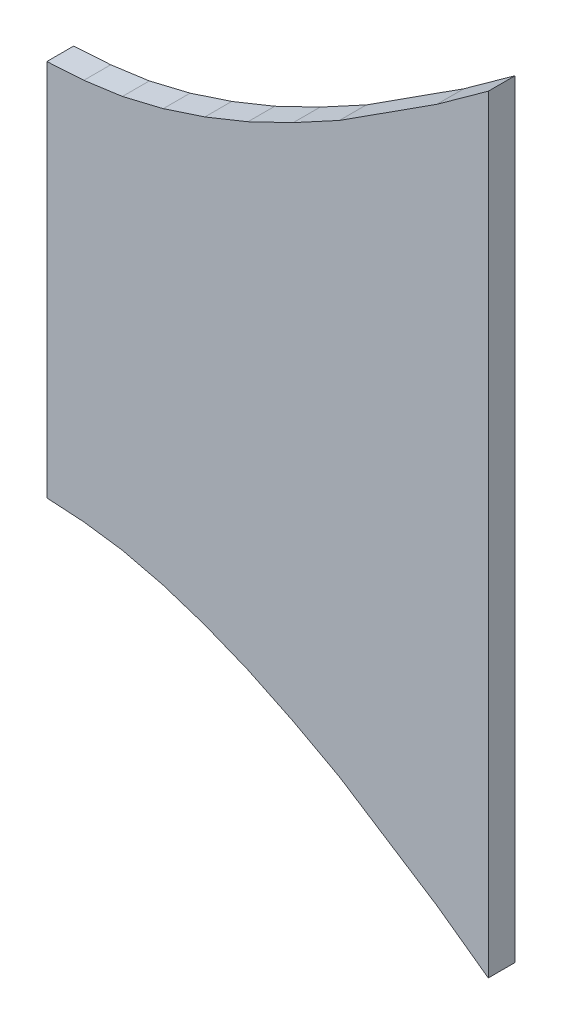
ISO-10303-21;
HEADER;
FILE_DESCRIPTION(('STEP AP214'),'2;1');
FILE_NAME('part.step','',(''),(''),'','','');
FILE_SCHEMA(('AUTOMOTIVE_DESIGN { 1 0 10303 214 1 1 1 1 }'));
ENDSEC;
DATA;
#1=APPLICATION_CONTEXT('core data for automotive mechanical design processes');
#2=APPLICATION_PROTOCOL_DEFINITION('international standard','automotive_design',2000,#1);
#3=PRODUCT_CONTEXT('',#1,'mechanical');
#4=PRODUCT('Part','Part','',(#3));
#5=PRODUCT_RELATED_PRODUCT_CATEGORY('part','',(#4));
#6=PRODUCT_DEFINITION_FORMATION('','',#4);
#7=PRODUCT_DEFINITION_CONTEXT('part definition',#1,'design');
#8=PRODUCT_DEFINITION('design','',#6,#7);
#9=PRODUCT_DEFINITION_SHAPE('','',#8);
#10=(LENGTH_UNIT() NAMED_UNIT(*) SI_UNIT(.MILLI.,.METRE.));
#11=(NAMED_UNIT(*) PLANE_ANGLE_UNIT() SI_UNIT($,.RADIAN.));
#12=(NAMED_UNIT(*) SI_UNIT($,.STERADIAN.) SOLID_ANGLE_UNIT());
#13=UNCERTAINTY_MEASURE_WITH_UNIT(LENGTH_MEASURE(1.E-05),#10,'distance_accuracy_value','');
#14=(GEOMETRIC_REPRESENTATION_CONTEXT(3) GLOBAL_UNCERTAINTY_ASSIGNED_CONTEXT((#13)) GLOBAL_UNIT_ASSIGNED_CONTEXT((#10,
#11,#12)) REPRESENTATION_CONTEXT('',''));
#15=CARTESIAN_POINT('',(0.,0.,0.));
#16=DIRECTION('',(0.,0.,1.));
#17=DIRECTION('',(1.,0.,0.));
#18=AXIS2_PLACEMENT_3D('',#15,#16,#17);
#19=CARTESIAN_POINT('',(86.9349975585938,111.75,0.));
#20=DIRECTION('',(0.0610721482467971,0.998133354170935,0.));
#21=DIRECTION('',(0.998133354170935,-0.0610721482467971,0.));
#22=AXIS2_PLACEMENT_3D('',#19,#20,#21);
#23=PLANE('',#22);
#24=DIRECTION('',(0.998133354170935,-0.0610721482467971,0.));
#25=VECTOR('',#24,1.);
#26=CARTESIAN_POINT('',(86.9349975585938,111.75,0.03556));
#27=LINE('',#26,#25);
#28=CARTESIAN_POINT('',(86.9349975585938,111.75,0.03556));
#29=VERTEX_POINT('',#28);
#30=CARTESIAN_POINT('',(86.984001159668,111.747001647949,0.03556));
#31=VERTEX_POINT('',#30);
#32=EDGE_CURVE('E11',#29,#31,#27,.T.);
#33=ORIENTED_EDGE('',*,*,#32,.F.);
#34=DIRECTION('',(0.,0.,1.));
#35=VECTOR('',#34,1.);
#36=CARTESIAN_POINT('',(86.9349975585938,111.75,0.));
#37=LINE('',#36,#35);
#38=CARTESIAN_POINT('',(86.9349975585938,111.75,0.));
#39=VERTEX_POINT('',#38);
#40=EDGE_CURVE('E24',#39,#29,#37,.T.);
#41=ORIENTED_EDGE('',*,*,#40,.F.);
#42=DIRECTION('',(0.998133354170935,-0.0610721482467971,0.));
#43=VECTOR('',#42,1.);
#44=CARTESIAN_POINT('',(86.9349975585938,111.75,0.));
#45=LINE('',#44,#43);
#46=CARTESIAN_POINT('',(86.984001159668,111.747001647949,0.));
#47=VERTEX_POINT('',#46);
#48=EDGE_CURVE('E172',#39,#47,#45,.T.);
#49=ORIENTED_EDGE('',*,*,#48,.T.);
#50=DIRECTION('',(0.,0.,1.));
#51=VECTOR('',#50,1.);
#52=CARTESIAN_POINT('',(86.984001159668,111.747001647949,0.));
#53=LINE('',#52,#51);
#54=EDGE_CURVE('E37',#47,#31,#53,.T.);
#55=ORIENTED_EDGE('',*,*,#54,.T.);
#56=EDGE_LOOP('',(#33,#41,#49,#55));
#57=FACE_BOUND('',#56,.T.);
#58=ADVANCED_FACE('F17',(#57),#23,.F.);
#59=CARTESIAN_POINT('',(86.984001159668,111.747001647949,0.));
#60=DIRECTION('',(0.136045618948407,0.990702573714707,0.));
#61=DIRECTION('',(0.990702573714707,-0.136045618948407,0.));
#62=AXIS2_PLACEMENT_3D('',#59,#60,#61);
#63=PLANE('',#62);
#64=DIRECTION('',(0.990702573714707,-0.136045618948407,0.));
#65=VECTOR('',#64,1.);
#66=CARTESIAN_POINT('',(86.984001159668,111.747001647949,0.03556));
#67=LINE('',#66,#65);
#68=CARTESIAN_POINT('',(87.0350036621094,111.73999786377,0.03556));
#69=VERTEX_POINT('',#68);
#70=EDGE_CURVE('E308',#31,#69,#67,.T.);
#71=ORIENTED_EDGE('',*,*,#70,.F.);
#72=ORIENTED_EDGE('',*,*,#54,.F.);
#73=DIRECTION('',(0.990702573714707,-0.136045618948407,0.));
#74=VECTOR('',#73,1.);
#75=CARTESIAN_POINT('',(86.984001159668,111.747001647949,0.));
#76=LINE('',#75,#74);
#77=CARTESIAN_POINT('',(87.0350036621094,111.73999786377,0.));
#78=VERTEX_POINT('',#77);
#79=EDGE_CURVE('E305',#47,#78,#76,.T.);
#80=ORIENTED_EDGE('',*,*,#79,.T.);
#81=DIRECTION('',(0.,0.,1.));
#82=VECTOR('',#81,1.);
#83=CARTESIAN_POINT('',(87.0350036621094,111.73999786377,0.));
#84=LINE('',#83,#82);
#85=EDGE_CURVE('E303',#78,#69,#84,.T.);
#86=ORIENTED_EDGE('',*,*,#85,.T.);
#87=EDGE_LOOP('',(#71,#72,#80,#86));
#88=FACE_BOUND('',#87,.T.);
#89=ADVANCED_FACE('F316',(#88),#63,.F.);
#90=CARTESIAN_POINT('',(87.0350036621094,111.73999786377,0.));
#91=DIRECTION('',(0.234089908148915,0.972214953033964,0.));
#92=DIRECTION('',(0.972214953033964,-0.234089908148915,0.));
#93=AXIS2_PLACEMENT_3D('',#90,#91,#92);
#94=PLANE('',#93);
#95=DIRECTION('',(0.972214953033964,-0.234089908148915,0.));
#96=VECTOR('',#95,1.);
#97=CARTESIAN_POINT('',(87.0350036621094,111.73999786377,0.03556));
#98=LINE('',#97,#96);
#99=CARTESIAN_POINT('',(87.088996887207,111.726997375488,0.03556));
#100=VERTEX_POINT('',#99);
#101=EDGE_CURVE('E300',#69,#100,#98,.T.);
#102=ORIENTED_EDGE('',*,*,#101,.F.);
#103=ORIENTED_EDGE('',*,*,#85,.F.);
#104=DIRECTION('',(0.972214953033964,-0.234089908148915,0.));
#105=VECTOR('',#104,1.);
#106=CARTESIAN_POINT('',(87.0350036621094,111.73999786377,0.));
#107=LINE('',#106,#105);
#108=CARTESIAN_POINT('',(87.088996887207,111.726997375488,0.));
#109=VERTEX_POINT('',#108);
#110=EDGE_CURVE('E297',#78,#109,#107,.T.);
#111=ORIENTED_EDGE('',*,*,#110,.T.);
#112=DIRECTION('',(0.,0.,1.));
#113=VECTOR('',#112,1.);
#114=CARTESIAN_POINT('',(87.088996887207,111.726997375488,0.));
#115=LINE('',#114,#113);
#116=EDGE_CURVE('E295',#109,#100,#115,.T.);
#117=ORIENTED_EDGE('',*,*,#116,.T.);
#118=EDGE_LOOP('',(#102,#103,#111,#117));
#119=FACE_BOUND('',#118,.T.);
#120=ADVANCED_FACE('F322',(#119),#94,.F.);
#121=CARTESIAN_POINT('',(87.088996887207,111.726997375488,0.));
#122=DIRECTION('',(0.311002253042668,0.950409174304617,0.));
#123=DIRECTION('',(0.950409174304617,-0.311002253042668,0.));
#124=AXIS2_PLACEMENT_3D('',#121,#122,#123);
#125=PLANE('',#124);
#126=DIRECTION('',(0.950409174304617,-0.311002253042668,0.));
#127=VECTOR('',#126,1.);
#128=CARTESIAN_POINT('',(87.088996887207,111.726997375488,0.03556));
#129=LINE('',#128,#127);
#130=CARTESIAN_POINT('',(87.1439971923828,111.708999633789,0.03556));
#131=VERTEX_POINT('',#130);
#132=EDGE_CURVE('E292',#100,#131,#129,.T.);
#133=ORIENTED_EDGE('',*,*,#132,.F.);
#134=ORIENTED_EDGE('',*,*,#116,.F.);
#135=DIRECTION('',(0.950409174304617,-0.311002253042668,0.));
#136=VECTOR('',#135,1.);
#137=CARTESIAN_POINT('',(87.088996887207,111.726997375488,0.));
#138=LINE('',#137,#136);
#139=CARTESIAN_POINT('',(87.1439971923828,111.708999633789,0.));
#140=VERTEX_POINT('',#139);
#141=EDGE_CURVE('E289',#109,#140,#138,.T.);
#142=ORIENTED_EDGE('',*,*,#141,.T.);
#143=DIRECTION('',(0.,0.,1.));
#144=VECTOR('',#143,1.);
#145=CARTESIAN_POINT('',(87.1439971923828,111.708999633789,0.));
#146=LINE('',#145,#144);
#147=EDGE_CURVE('E287',#140,#131,#146,.T.);
#148=ORIENTED_EDGE('',*,*,#147,.T.);
#149=EDGE_LOOP('',(#133,#134,#142,#148));
#150=FACE_BOUND('',#149,.T.);
#151=ADVANCED_FACE('F324',(#150),#125,.F.);
#152=CARTESIAN_POINT('',(87.1439971923828,111.708999633789,0.));
#153=DIRECTION('',(0.374235233417141,0.927333807250236,0.));
#154=DIRECTION('',(0.927333807250236,-0.374235233417141,0.));
#155=AXIS2_PLACEMENT_3D('',#152,#153,#154);
#156=PLANE('',#155);
#157=DIRECTION('',(0.927333807250236,-0.374235233417141,0.));
#158=VECTOR('',#157,1.);
#159=CARTESIAN_POINT('',(87.1439971923828,111.708999633789,0.03556));
#160=LINE('',#159,#158);
#161=CARTESIAN_POINT('',(87.2009963989258,111.685997009277,0.03556));
#162=VERTEX_POINT('',#161);
#163=EDGE_CURVE('E284',#131,#162,#160,.T.);
#164=ORIENTED_EDGE('',*,*,#163,.F.);
#165=ORIENTED_EDGE('',*,*,#147,.F.);
#166=DIRECTION('',(0.927333807250236,-0.374235233417141,0.));
#167=VECTOR('',#166,1.);
#168=CARTESIAN_POINT('',(87.1439971923828,111.708999633789,0.));
#169=LINE('',#168,#167);
#170=CARTESIAN_POINT('',(87.2009963989258,111.685997009277,0.));
#171=VERTEX_POINT('',#170);
#172=EDGE_CURVE('E281',#140,#171,#169,.T.);
#173=ORIENTED_EDGE('',*,*,#172,.T.);
#174=DIRECTION('',(0.,0.,1.));
#175=VECTOR('',#174,1.);
#176=CARTESIAN_POINT('',(87.2009963989258,111.685997009277,0.));
#177=LINE('',#176,#175);
#178=EDGE_CURVE('E279',#171,#162,#177,.T.);
#179=ORIENTED_EDGE('',*,*,#178,.T.);
#180=EDGE_LOOP('',(#164,#165,#173,#179));
#181=FACE_BOUND('',#180,.T.);
#182=ADVANCED_FACE('F329',(#181),#156,.F.);
#183=CARTESIAN_POINT('',(87.2009963989258,111.685997009277,0.));
#184=DIRECTION('',(0.435129993926157,0.900367640681196,0.));
#185=DIRECTION('',(0.900367640681196,-0.435129993926157,0.));
#186=AXIS2_PLACEMENT_3D('',#183,#184,#185);
#187=PLANE('',#186);
#188=DIRECTION('',(0.900367640681196,-0.435129993926157,0.));
#189=VECTOR('',#188,1.);
#190=CARTESIAN_POINT('',(87.2009963989258,111.685997009277,0.03556));
#191=LINE('',#190,#189);
#192=CARTESIAN_POINT('',(87.2610015869141,111.656997680664,0.03556));
#193=VERTEX_POINT('',#192);
#194=EDGE_CURVE('E276',#162,#193,#191,.T.);
#195=ORIENTED_EDGE('',*,*,#194,.F.);
#196=ORIENTED_EDGE('',*,*,#178,.F.);
#197=DIRECTION('',(0.900367640681196,-0.435129993926157,0.));
#198=VECTOR('',#197,1.);
#199=CARTESIAN_POINT('',(87.2009963989258,111.685997009277,0.));
#200=LINE('',#199,#198);
#201=CARTESIAN_POINT('',(87.2610015869141,111.656997680664,0.));
#202=VERTEX_POINT('',#201);
#203=EDGE_CURVE('E273',#171,#202,#200,.T.);
#204=ORIENTED_EDGE('',*,*,#203,.T.);
#205=DIRECTION('',(0.,0.,1.));
#206=VECTOR('',#205,1.);
#207=CARTESIAN_POINT('',(87.2610015869141,111.656997680664,0.));
#208=LINE('',#207,#206);
#209=EDGE_CURVE('E271',#202,#193,#208,.T.);
#210=ORIENTED_EDGE('',*,*,#209,.T.);
#211=EDGE_LOOP('',(#195,#196,#204,#210));
#212=FACE_BOUND('',#211,.T.);
#213=ADVANCED_FACE('F332',(#212),#187,.F.);
#214=CARTESIAN_POINT('',(87.2610015869141,111.656997680664,0.));
#215=DIRECTION('',(0.475804633835186,0.879550993644464,0.));
#216=DIRECTION('',(0.879550993644464,-0.475804633835186,0.));
#217=AXIS2_PLACEMENT_3D('',#214,#215,#216);
#218=PLANE('',#217);
#219=DIRECTION('',(0.879550993644464,-0.475804633835186,0.));
#220=VECTOR('',#219,1.);
#221=CARTESIAN_POINT('',(87.2610015869141,111.656997680664,0.03556));
#222=LINE('',#221,#220);
#223=CARTESIAN_POINT('',(87.3219985961914,111.624000549316,0.03556));
#224=VERTEX_POINT('',#223);
#225=EDGE_CURVE('E268',#193,#224,#222,.T.);
#226=ORIENTED_EDGE('',*,*,#225,.F.);
#227=ORIENTED_EDGE('',*,*,#209,.F.);
#228=DIRECTION('',(0.879550993644464,-0.475804633835186,0.));
#229=VECTOR('',#228,1.);
#230=CARTESIAN_POINT('',(87.2610015869141,111.656997680664,0.));
#231=LINE('',#230,#229);
#232=CARTESIAN_POINT('',(87.3219985961914,111.624000549316,0.));
#233=VERTEX_POINT('',#232);
#234=EDGE_CURVE('E265',#202,#233,#231,.T.);
#235=ORIENTED_EDGE('',*,*,#234,.T.);
#236=DIRECTION('',(0.,0.,1.));
#237=VECTOR('',#236,1.);
#238=CARTESIAN_POINT('',(87.3219985961914,111.624000549316,0.));
#239=LINE('',#238,#237);
#240=EDGE_CURVE('E263',#233,#224,#239,.T.);
#241=ORIENTED_EDGE('',*,*,#240,.T.);
#242=EDGE_LOOP('',(#226,#227,#235,#241));
#243=FACE_BOUND('',#242,.T.);
#244=ADVANCED_FACE('F337',(#243),#218,.F.);
#245=CARTESIAN_POINT('',(87.3219985961914,111.624000549316,0.));
#246=DIRECTION('',(0.541094398400977,0.840961861215528,0.));
#247=DIRECTION('',(0.840961861215528,-0.541094398400977,0.));
#248=AXIS2_PLACEMENT_3D('',#245,#246,#247);
#249=PLANE('',#248);
#250=DIRECTION('',(0.840961861215528,-0.541094398400977,0.));
#251=VECTOR('',#250,1.);
#252=CARTESIAN_POINT('',(87.3219985961914,111.624000549316,0.03556));
#253=LINE('',#252,#251);
#254=CARTESIAN_POINT('',(87.4509963989258,111.541000366211,0.03556));
#255=VERTEX_POINT('',#254);
#256=EDGE_CURVE('E260',#224,#255,#253,.T.);
#257=ORIENTED_EDGE('',*,*,#256,.F.);
#258=ORIENTED_EDGE('',*,*,#240,.F.);
#259=DIRECTION('',(0.840961861215528,-0.541094398400977,0.));
#260=VECTOR('',#259,1.);
#261=CARTESIAN_POINT('',(87.3219985961914,111.624000549316,0.));
#262=LINE('',#261,#260);
#263=CARTESIAN_POINT('',(87.4509963989258,111.541000366211,0.));
#264=VERTEX_POINT('',#263);
#265=EDGE_CURVE('E257',#233,#264,#262,.T.);
#266=ORIENTED_EDGE('',*,*,#265,.T.);
#267=DIRECTION('',(0.,0.,1.));
#268=VECTOR('',#267,1.);
#269=CARTESIAN_POINT('',(87.4509963989258,111.541000366211,0.));
#270=LINE('',#269,#268);
#271=EDGE_CURVE('E255',#264,#255,#270,.T.);
#272=ORIENTED_EDGE('',*,*,#271,.T.);
#273=EDGE_LOOP('',(#257,#258,#266,#272));
#274=FACE_BOUND('',#273,.T.);
#275=ADVANCED_FACE('F340',(#274),#249,.F.);
#276=CARTESIAN_POINT('',(87.4509963989258,111.541000366211,0.));
#277=DIRECTION('',(0.584642775450006,0.811290838795875,0.));
#278=DIRECTION('',(0.811290838795875,-0.584642775450006,0.));
#279=AXIS2_PLACEMENT_3D('',#276,#277,#278);
#280=PLANE('',#279);
#281=DIRECTION('',(0.811290838795875,-0.584642775450006,0.));
#282=VECTOR('',#281,1.);
#283=CARTESIAN_POINT('',(87.4509963989258,111.541000366211,0.03556));
#284=LINE('',#283,#282);
#285=CARTESIAN_POINT('',(87.5189971923828,111.491996765137,0.03556));
#286=VERTEX_POINT('',#285);
#287=EDGE_CURVE('E252',#255,#286,#284,.T.);
#288=ORIENTED_EDGE('',*,*,#287,.F.);
#289=ORIENTED_EDGE('',*,*,#271,.F.);
#290=DIRECTION('',(0.811290838795875,-0.584642775450006,0.));
#291=VECTOR('',#290,1.);
#292=CARTESIAN_POINT('',(87.4509963989258,111.541000366211,0.));
#293=LINE('',#292,#291);
#294=CARTESIAN_POINT('',(87.5189971923828,111.491996765137,0.));
#295=VERTEX_POINT('',#294);
#296=EDGE_CURVE('E249',#264,#295,#293,.T.);
#297=ORIENTED_EDGE('',*,*,#296,.T.);
#298=DIRECTION('',(0.,0.,1.));
#299=VECTOR('',#298,1.);
#300=CARTESIAN_POINT('',(87.5189971923828,111.491996765137,0.));
#301=LINE('',#300,#299);
#302=EDGE_CURVE('E247',#295,#286,#301,.T.);
#303=ORIENTED_EDGE('',*,*,#302,.T.);
#304=EDGE_LOOP('',(#288,#289,#297,#303));
#305=FACE_BOUND('',#304,.T.);
#306=ADVANCED_FACE('F345',(#305),#280,.F.);
#307=CARTESIAN_POINT('',(87.5189971923828,111.491996765137,0.));
#308=DIRECTION('',(-1.,0.,0.));
#309=DIRECTION('',(0.,1.,0.));
#310=AXIS2_PLACEMENT_3D('',#307,#308,#309);
#311=PLANE('',#310);
#312=DIRECTION('',(0.,1.,0.));
#313=VECTOR('',#312,1.);
#314=CARTESIAN_POINT('',(87.5189971923828,111.491996765137,0.03556));
#315=LINE('',#314,#313);
#316=CARTESIAN_POINT('',(87.5189971923828,112.508003234863,0.03556));
#317=VERTEX_POINT('',#316);
#318=EDGE_CURVE('E244',#286,#317,#315,.T.);
#319=ORIENTED_EDGE('',*,*,#318,.F.);
#320=ORIENTED_EDGE('',*,*,#302,.F.);
#321=DIRECTION('',(0.,1.,0.));
#322=VECTOR('',#321,1.);
#323=CARTESIAN_POINT('',(87.5189971923828,111.491996765137,0.));
#324=LINE('',#323,#322);
#325=CARTESIAN_POINT('',(87.5189971923828,112.508003234863,0.));
#326=VERTEX_POINT('',#325);
#327=EDGE_CURVE('E241',#295,#326,#324,.T.);
#328=ORIENTED_EDGE('',*,*,#327,.T.);
#329=DIRECTION('',(0.,0.,1.));
#330=VECTOR('',#329,1.);
#331=CARTESIAN_POINT('',(87.5189971923828,112.508003234863,0.));
#332=LINE('',#331,#330);
#333=EDGE_CURVE('E239',#326,#317,#332,.T.);
#334=ORIENTED_EDGE('',*,*,#333,.T.);
#335=EDGE_LOOP('',(#319,#320,#328,#334));
#336=FACE_BOUND('',#335,.T.);
#337=ADVANCED_FACE('F348',(#336),#311,.F.);
#338=CARTESIAN_POINT('',(87.5189971923828,112.508003234863,0.));
#339=DIRECTION('',(0.584642775450006,-0.811290838795875,0.));
#340=DIRECTION('',(-0.811290838795875,-0.584642775450006,0.));
#341=AXIS2_PLACEMENT_3D('',#338,#339,#340);
#342=PLANE('',#341);
#343=DIRECTION('',(-0.811290838795875,-0.584642775450006,0.));
#344=VECTOR('',#343,1.);
#345=CARTESIAN_POINT('',(87.5189971923828,112.508003234863,0.03556));
#346=LINE('',#345,#344);
#347=CARTESIAN_POINT('',(87.4509963989258,112.458999633789,0.03556));
#348=VERTEX_POINT('',#347);
#349=EDGE_CURVE('E236',#317,#348,#346,.T.);
#350=ORIENTED_EDGE('',*,*,#349,.F.);
#351=ORIENTED_EDGE('',*,*,#333,.F.);
#352=DIRECTION('',(-0.811290838795875,-0.584642775450006,0.));
#353=VECTOR('',#352,1.);
#354=CARTESIAN_POINT('',(87.5189971923828,112.508003234863,0.));
#355=LINE('',#354,#353);
#356=CARTESIAN_POINT('',(87.4509963989258,112.458999633789,0.));
#357=VERTEX_POINT('',#356);
#358=EDGE_CURVE('E233',#326,#357,#355,.T.);
#359=ORIENTED_EDGE('',*,*,#358,.T.);
#360=DIRECTION('',(0.,0.,1.));
#361=VECTOR('',#360,1.);
#362=CARTESIAN_POINT('',(87.4509963989258,112.458999633789,0.));
#363=LINE('',#362,#361);
#364=EDGE_CURVE('E231',#357,#348,#363,.T.);
#365=ORIENTED_EDGE('',*,*,#364,.T.);
#366=EDGE_LOOP('',(#350,#351,#359,#365));
#367=FACE_BOUND('',#366,.T.);
#368=ADVANCED_FACE('F353',(#367),#342,.F.);
#369=CARTESIAN_POINT('',(87.4509963989258,112.458999633789,0.));
#370=DIRECTION('',(0.541094398400977,-0.840961861215528,0.));
#371=DIRECTION('',(-0.840961861215528,-0.541094398400977,0.));
#372=AXIS2_PLACEMENT_3D('',#369,#370,#371);
#373=PLANE('',#372);
#374=DIRECTION('',(-0.840961861215528,-0.541094398400977,0.));
#375=VECTOR('',#374,1.);
#376=CARTESIAN_POINT('',(87.4509963989258,112.458999633789,0.03556));
#377=LINE('',#376,#375);
#378=CARTESIAN_POINT('',(87.3219985961914,112.375999450684,0.03556));
#379=VERTEX_POINT('',#378);
#380=EDGE_CURVE('E228',#348,#379,#377,.T.);
#381=ORIENTED_EDGE('',*,*,#380,.F.);
#382=ORIENTED_EDGE('',*,*,#364,.F.);
#383=DIRECTION('',(-0.840961861215528,-0.541094398400977,0.));
#384=VECTOR('',#383,1.);
#385=CARTESIAN_POINT('',(87.4509963989258,112.458999633789,0.));
#386=LINE('',#385,#384);
#387=CARTESIAN_POINT('',(87.3219985961914,112.375999450684,0.));
#388=VERTEX_POINT('',#387);
#389=EDGE_CURVE('E225',#357,#388,#386,.T.);
#390=ORIENTED_EDGE('',*,*,#389,.T.);
#391=DIRECTION('',(0.,0.,1.));
#392=VECTOR('',#391,1.);
#393=CARTESIAN_POINT('',(87.3219985961914,112.375999450684,0.));
#394=LINE('',#393,#392);
#395=EDGE_CURVE('E223',#388,#379,#394,.T.);
#396=ORIENTED_EDGE('',*,*,#395,.T.);
#397=EDGE_LOOP('',(#381,#382,#390,#396));
#398=FACE_BOUND('',#397,.T.);
#399=ADVANCED_FACE('F356',(#398),#373,.F.);
#400=CARTESIAN_POINT('',(87.3219985961914,112.375999450684,0.));
#401=DIRECTION('',(0.475804633835186,-0.879550993644464,0.));
#402=DIRECTION('',(-0.879550993644464,-0.475804633835186,0.));
#403=AXIS2_PLACEMENT_3D('',#400,#401,#402);
#404=PLANE('',#403);
#405=DIRECTION('',(-0.879550993644464,-0.475804633835186,0.));
#406=VECTOR('',#405,1.);
#407=CARTESIAN_POINT('',(87.3219985961914,112.375999450684,0.03556));
#408=LINE('',#407,#406);
#409=CARTESIAN_POINT('',(87.2610015869141,112.343002319336,0.03556));
#410=VERTEX_POINT('',#409);
#411=EDGE_CURVE('E220',#379,#410,#408,.T.);
#412=ORIENTED_EDGE('',*,*,#411,.F.);
#413=ORIENTED_EDGE('',*,*,#395,.F.);
#414=DIRECTION('',(-0.879550993644464,-0.475804633835186,0.));
#415=VECTOR('',#414,1.);
#416=CARTESIAN_POINT('',(87.3219985961914,112.375999450684,0.));
#417=LINE('',#416,#415);
#418=CARTESIAN_POINT('',(87.2610015869141,112.343002319336,0.));
#419=VERTEX_POINT('',#418);
#420=EDGE_CURVE('E217',#388,#419,#417,.T.);
#421=ORIENTED_EDGE('',*,*,#420,.T.);
#422=DIRECTION('',(0.,0.,1.));
#423=VECTOR('',#422,1.);
#424=CARTESIAN_POINT('',(87.2610015869141,112.343002319336,0.));
#425=LINE('',#424,#423);
#426=EDGE_CURVE('E215',#419,#410,#425,.T.);
#427=ORIENTED_EDGE('',*,*,#426,.T.);
#428=EDGE_LOOP('',(#412,#413,#421,#427));
#429=FACE_BOUND('',#428,.T.);
#430=ADVANCED_FACE('F361',(#429),#404,.F.);
#431=CARTESIAN_POINT('',(87.2610015869141,112.343002319336,0.));
#432=DIRECTION('',(0.435129993926157,-0.900367640681196,0.));
#433=DIRECTION('',(-0.900367640681196,-0.435129993926157,0.));
#434=AXIS2_PLACEMENT_3D('',#431,#432,#433);
#435=PLANE('',#434);
#436=DIRECTION('',(-0.900367640681196,-0.435129993926157,0.));
#437=VECTOR('',#436,1.);
#438=CARTESIAN_POINT('',(87.2610015869141,112.343002319336,0.03556));
#439=LINE('',#438,#437);
#440=CARTESIAN_POINT('',(87.2009963989258,112.314002990723,0.03556));
#441=VERTEX_POINT('',#440);
#442=EDGE_CURVE('E212',#410,#441,#439,.T.);
#443=ORIENTED_EDGE('',*,*,#442,.F.);
#444=ORIENTED_EDGE('',*,*,#426,.F.);
#445=DIRECTION('',(-0.900367640681196,-0.435129993926157,0.));
#446=VECTOR('',#445,1.);
#447=CARTESIAN_POINT('',(87.2610015869141,112.343002319336,0.));
#448=LINE('',#447,#446);
#449=CARTESIAN_POINT('',(87.2009963989258,112.314002990723,0.));
#450=VERTEX_POINT('',#449);
#451=EDGE_CURVE('E209',#419,#450,#448,.T.);
#452=ORIENTED_EDGE('',*,*,#451,.T.);
#453=DIRECTION('',(0.,0.,1.));
#454=VECTOR('',#453,1.);
#455=CARTESIAN_POINT('',(87.2009963989258,112.314002990723,0.));
#456=LINE('',#455,#454);
#457=EDGE_CURVE('E207',#450,#441,#456,.T.);
#458=ORIENTED_EDGE('',*,*,#457,.T.);
#459=EDGE_LOOP('',(#443,#444,#452,#458));
#460=FACE_BOUND('',#459,.T.);
#461=ADVANCED_FACE('F364',(#460),#435,.F.);
#462=CARTESIAN_POINT('',(87.2009963989258,112.314002990723,0.));
#463=DIRECTION('',(0.374235233417141,-0.927333807250236,0.));
#464=DIRECTION('',(-0.927333807250236,-0.374235233417141,0.));
#465=AXIS2_PLACEMENT_3D('',#462,#463,#464);
#466=PLANE('',#465);
#467=DIRECTION('',(-0.927333807250236,-0.374235233417141,0.));
#468=VECTOR('',#467,1.);
#469=CARTESIAN_POINT('',(87.2009963989258,112.314002990723,0.03556));
#470=LINE('',#469,#468);
#471=CARTESIAN_POINT('',(87.1439971923828,112.291000366211,0.03556));
#472=VERTEX_POINT('',#471);
#473=EDGE_CURVE('E204',#441,#472,#470,.T.);
#474=ORIENTED_EDGE('',*,*,#473,.F.);
#475=ORIENTED_EDGE('',*,*,#457,.F.);
#476=DIRECTION('',(-0.927333807250236,-0.374235233417141,0.));
#477=VECTOR('',#476,1.);
#478=CARTESIAN_POINT('',(87.2009963989258,112.314002990723,0.));
#479=LINE('',#478,#477);
#480=CARTESIAN_POINT('',(87.1439971923828,112.291000366211,0.));
#481=VERTEX_POINT('',#480);
#482=EDGE_CURVE('E201',#450,#481,#479,.T.);
#483=ORIENTED_EDGE('',*,*,#482,.T.);
#484=DIRECTION('',(0.,0.,1.));
#485=VECTOR('',#484,1.);
#486=CARTESIAN_POINT('',(87.1439971923828,112.291000366211,0.));
#487=LINE('',#486,#485);
#488=EDGE_CURVE('E199',#481,#472,#487,.T.);
#489=ORIENTED_EDGE('',*,*,#488,.T.);
#490=EDGE_LOOP('',(#474,#475,#483,#489));
#491=FACE_BOUND('',#490,.T.);
#492=ADVANCED_FACE('F369',(#491),#466,.F.);
#493=CARTESIAN_POINT('',(87.1439971923828,112.291000366211,0.));
#494=DIRECTION('',(0.311002253042668,-0.950409174304617,0.));
#495=DIRECTION('',(-0.950409174304617,-0.311002253042668,0.));
#496=AXIS2_PLACEMENT_3D('',#493,#494,#495);
#497=PLANE('',#496);
#498=DIRECTION('',(-0.950409174304617,-0.311002253042668,0.));
#499=VECTOR('',#498,1.);
#500=CARTESIAN_POINT('',(87.1439971923828,112.291000366211,0.03556));
#501=LINE('',#500,#499);
#502=CARTESIAN_POINT('',(87.088996887207,112.273002624512,0.03556));
#503=VERTEX_POINT('',#502);
#504=EDGE_CURVE('E196',#472,#503,#501,.T.);
#505=ORIENTED_EDGE('',*,*,#504,.F.);
#506=ORIENTED_EDGE('',*,*,#488,.F.);
#507=DIRECTION('',(-0.950409174304617,-0.311002253042668,0.));
#508=VECTOR('',#507,1.);
#509=CARTESIAN_POINT('',(87.1439971923828,112.291000366211,0.));
#510=LINE('',#509,#508);
#511=CARTESIAN_POINT('',(87.088996887207,112.273002624512,0.));
#512=VERTEX_POINT('',#511);
#513=EDGE_CURVE('E193',#481,#512,#510,.T.);
#514=ORIENTED_EDGE('',*,*,#513,.T.);
#515=DIRECTION('',(0.,0.,1.));
#516=VECTOR('',#515,1.);
#517=CARTESIAN_POINT('',(87.088996887207,112.273002624512,0.));
#518=LINE('',#517,#516);
#519=EDGE_CURVE('E191',#512,#503,#518,.T.);
#520=ORIENTED_EDGE('',*,*,#519,.T.);
#521=EDGE_LOOP('',(#505,#506,#514,#520));
#522=FACE_BOUND('',#521,.T.);
#523=ADVANCED_FACE('F372',(#522),#497,.F.);
#524=CARTESIAN_POINT('',(87.088996887207,112.273002624512,0.));
#525=DIRECTION('',(0.234089908148915,-0.972214953033964,0.));
#526=DIRECTION('',(-0.972214953033964,-0.234089908148915,0.));
#527=AXIS2_PLACEMENT_3D('',#524,#525,#526);
#528=PLANE('',#527);
#529=DIRECTION('',(-0.972214953033964,-0.234089908148915,0.));
#530=VECTOR('',#529,1.);
#531=CARTESIAN_POINT('',(87.088996887207,112.273002624512,0.03556));
#532=LINE('',#531,#530);
#533=CARTESIAN_POINT('',(87.0350036621094,112.260002136231,0.03556));
#534=VERTEX_POINT('',#533);
#535=EDGE_CURVE('E188',#503,#534,#532,.T.);
#536=ORIENTED_EDGE('',*,*,#535,.F.);
#537=ORIENTED_EDGE('',*,*,#519,.F.);
#538=DIRECTION('',(-0.972214953033964,-0.234089908148915,0.));
#539=VECTOR('',#538,1.);
#540=CARTESIAN_POINT('',(87.088996887207,112.273002624512,0.));
#541=LINE('',#540,#539);
#542=CARTESIAN_POINT('',(87.0350036621094,112.260002136231,0.));
#543=VERTEX_POINT('',#542);
#544=EDGE_CURVE('E185',#512,#543,#541,.T.);
#545=ORIENTED_EDGE('',*,*,#544,.T.);
#546=DIRECTION('',(0.,0.,1.));
#547=VECTOR('',#546,1.);
#548=CARTESIAN_POINT('',(87.0350036621094,112.260002136231,0.));
#549=LINE('',#548,#547);
#550=EDGE_CURVE('E183',#543,#534,#549,.T.);
#551=ORIENTED_EDGE('',*,*,#550,.T.);
#552=EDGE_LOOP('',(#536,#537,#545,#551));
#553=FACE_BOUND('',#552,.T.);
#554=ADVANCED_FACE('F377',(#553),#528,.F.);
#555=CARTESIAN_POINT('',(87.0350036621094,112.260002136231,0.));
#556=DIRECTION('',(0.136045618948407,-0.990702573714707,0.));
#557=DIRECTION('',(-0.990702573714707,-0.136045618948407,0.));
#558=AXIS2_PLACEMENT_3D('',#555,#556,#557);
#559=PLANE('',#558);
#560=DIRECTION('',(-0.990702573714707,-0.136045618948407,0.));
#561=VECTOR('',#560,1.);
#562=CARTESIAN_POINT('',(87.0350036621094,112.260002136231,0.03556));
#563=LINE('',#562,#561);
#564=CARTESIAN_POINT('',(86.984001159668,112.252998352051,0.03556));
#565=VERTEX_POINT('',#564);
#566=EDGE_CURVE('E180',#534,#565,#563,.T.);
#567=ORIENTED_EDGE('',*,*,#566,.F.);
#568=ORIENTED_EDGE('',*,*,#550,.F.);
#569=DIRECTION('',(-0.990702573714707,-0.136045618948407,0.));
#570=VECTOR('',#569,1.);
#571=CARTESIAN_POINT('',(87.0350036621094,112.260002136231,0.));
#572=LINE('',#571,#570);
#573=CARTESIAN_POINT('',(86.984001159668,112.252998352051,0.));
#574=VERTEX_POINT('',#573);
#575=EDGE_CURVE('E178',#543,#574,#572,.T.);
#576=ORIENTED_EDGE('',*,*,#575,.T.);
#577=DIRECTION('',(0.,0.,1.));
#578=VECTOR('',#577,1.);
#579=CARTESIAN_POINT('',(86.984001159668,112.252998352051,0.));
#580=LINE('',#579,#578);
#581=EDGE_CURVE('E163',#574,#565,#580,.T.);
#582=ORIENTED_EDGE('',*,*,#581,.T.);
#583=EDGE_LOOP('',(#567,#568,#576,#582));
#584=FACE_BOUND('',#583,.T.);
#585=ADVANCED_FACE('F379',(#584),#559,.F.);
#586=CARTESIAN_POINT('',(86.984001159668,112.252998352051,0.));
#587=DIRECTION('',(0.0610721482467971,-0.998133354170935,0.));
#588=DIRECTION('',(-0.998133354170935,-0.0610721482467971,0.));
#589=AXIS2_PLACEMENT_3D('',#586,#587,#588);
#590=PLANE('',#589);
#591=DIRECTION('',(-0.998133354170935,-0.0610721482467971,0.));
#592=VECTOR('',#591,1.);
#593=CARTESIAN_POINT('',(86.984001159668,112.252998352051,0.03556));
#594=LINE('',#593,#592);
#595=CARTESIAN_POINT('',(86.9349975585938,112.25,0.03556));
#596=VERTEX_POINT('',#595);
#597=EDGE_CURVE('E167',#565,#596,#594,.T.);
#598=ORIENTED_EDGE('',*,*,#597,.F.);
#599=ORIENTED_EDGE('',*,*,#581,.F.);
#600=DIRECTION('',(-0.998133354170935,-0.0610721482467971,0.));
#601=VECTOR('',#600,1.);
#602=CARTESIAN_POINT('',(86.984001159668,112.252998352051,0.));
#603=LINE('',#602,#601);
#604=CARTESIAN_POINT('',(86.9349975585938,112.25,0.));
#605=VERTEX_POINT('',#604);
#606=EDGE_CURVE('E159',#574,#605,#603,.T.);
#607=ORIENTED_EDGE('',*,*,#606,.T.);
#608=DIRECTION('',(0.,0.,1.));
#609=VECTOR('',#608,1.);
#610=CARTESIAN_POINT('',(86.9349975585938,112.25,0.));
#611=LINE('',#610,#609);
#612=EDGE_CURVE('E149',#605,#596,#611,.T.);
#613=ORIENTED_EDGE('',*,*,#612,.T.);
#614=EDGE_LOOP('',(#598,#599,#607,#613));
#615=FACE_BOUND('',#614,.T.);
#616=ADVANCED_FACE('F162',(#615),#590,.F.);
#617=CARTESIAN_POINT('',(86.9349975585938,112.25,0.));
#618=DIRECTION('',(1.,0.,0.));
#619=DIRECTION('',(0.,-1.,0.));
#620=AXIS2_PLACEMENT_3D('',#617,#618,#619);
#621=PLANE('',#620);
#622=DIRECTION('',(0.,-1.,0.));
#623=VECTOR('',#622,1.);
#624=CARTESIAN_POINT('',(86.9349975585938,112.25,0.03556));
#625=LINE('',#624,#623);
#626=EDGE_CURVE('E155',#596,#29,#625,.T.);
#627=ORIENTED_EDGE('',*,*,#626,.F.);
#628=ORIENTED_EDGE('',*,*,#612,.F.);
#629=DIRECTION('',(0.,-1.,0.));
#630=VECTOR('',#629,1.);
#631=CARTESIAN_POINT('',(86.9349975585938,112.25,0.));
#632=LINE('',#631,#630);
#633=EDGE_CURVE('E153',#605,#39,#632,.T.);
#634=ORIENTED_EDGE('',*,*,#633,.T.);
#635=ORIENTED_EDGE('',*,*,#40,.T.);
#636=EDGE_LOOP('',(#627,#628,#634,#635));
#637=FACE_BOUND('',#636,.T.);
#638=ADVANCED_FACE('F151',(#637),#621,.F.);
#639=CARTESIAN_POINT('',(86.9349975585938,111.75,0.));
#640=DIRECTION('',(0.,0.,1.));
#641=DIRECTION('',(1.,0.,0.));
#642=AXIS2_PLACEMENT_3D('',#639,#640,#641);
#643=PLANE('',#642);
#644=ORIENTED_EDGE('',*,*,#633,.F.);
#645=ORIENTED_EDGE('',*,*,#606,.F.);
#646=ORIENTED_EDGE('',*,*,#575,.F.);
#647=ORIENTED_EDGE('',*,*,#544,.F.);
#648=ORIENTED_EDGE('',*,*,#513,.F.);
#649=ORIENTED_EDGE('',*,*,#482,.F.);
#650=ORIENTED_EDGE('',*,*,#451,.F.);
#651=ORIENTED_EDGE('',*,*,#420,.F.);
#652=ORIENTED_EDGE('',*,*,#389,.F.);
#653=ORIENTED_EDGE('',*,*,#358,.F.);
#654=ORIENTED_EDGE('',*,*,#327,.F.);
#655=ORIENTED_EDGE('',*,*,#296,.F.);
#656=ORIENTED_EDGE('',*,*,#265,.F.);
#657=ORIENTED_EDGE('',*,*,#234,.F.);
#658=ORIENTED_EDGE('',*,*,#203,.F.);
#659=ORIENTED_EDGE('',*,*,#172,.F.);
#660=ORIENTED_EDGE('',*,*,#141,.F.);
#661=ORIENTED_EDGE('',*,*,#110,.F.);
#662=ORIENTED_EDGE('',*,*,#79,.F.);
#663=ORIENTED_EDGE('',*,*,#48,.F.);
#664=EDGE_LOOP('',(#644,#645,#646,#647,#648,#649,#650,#651,#652,#653,#654,#655,#656,#657,#658,
#659,#660,#661,#662,#663));
#665=FACE_BOUND('',#664,.T.);
#666=ADVANCED_FACE('F170',(#665),#643,.F.);
#667=CARTESIAN_POINT('',(86.9349975585938,111.75,0.03556));
#668=DIRECTION('',(0.,0.,1.));
#669=DIRECTION('',(1.,0.,0.));
#670=AXIS2_PLACEMENT_3D('',#667,#668,#669);
#671=PLANE('',#670);
#672=ORIENTED_EDGE('',*,*,#32,.T.);
#673=ORIENTED_EDGE('',*,*,#70,.T.);
#674=ORIENTED_EDGE('',*,*,#101,.T.);
#675=ORIENTED_EDGE('',*,*,#132,.T.);
#676=ORIENTED_EDGE('',*,*,#163,.T.);
#677=ORIENTED_EDGE('',*,*,#194,.T.);
#678=ORIENTED_EDGE('',*,*,#225,.T.);
#679=ORIENTED_EDGE('',*,*,#256,.T.);
#680=ORIENTED_EDGE('',*,*,#287,.T.);
#681=ORIENTED_EDGE('',*,*,#318,.T.);
#682=ORIENTED_EDGE('',*,*,#349,.T.);
#683=ORIENTED_EDGE('',*,*,#380,.T.);
#684=ORIENTED_EDGE('',*,*,#411,.T.);
#685=ORIENTED_EDGE('',*,*,#442,.T.);
#686=ORIENTED_EDGE('',*,*,#473,.T.);
#687=ORIENTED_EDGE('',*,*,#504,.T.);
#688=ORIENTED_EDGE('',*,*,#535,.T.);
#689=ORIENTED_EDGE('',*,*,#566,.T.);
#690=ORIENTED_EDGE('',*,*,#597,.T.);
#691=ORIENTED_EDGE('',*,*,#626,.T.);
#692=EDGE_LOOP('',(#672,#673,#674,#675,#676,#677,#678,#679,#680,#681,#682,#683,#684,#685,#686,
#687,#688,#689,#690,#691));
#693=FACE_BOUND('',#692,.T.);
#694=ADVANCED_FACE('F319',(#693),#671,.T.);
#695=CLOSED_SHELL('',(#58,#89,#120,#151,#182,#213,#244,#275,#306,#337,#368,#399,#430,#461,#492,
#523,#554,#585,#616,#638,#666,#694));
#696=MANIFOLD_SOLID_BREP('B1',#695);
#697=ADVANCED_BREP_SHAPE_REPRESENTATION('',(#18,#696),#14);
#698=SHAPE_DEFINITION_REPRESENTATION(#9,#697);
ENDSEC;
END-ISO-10303-21;
